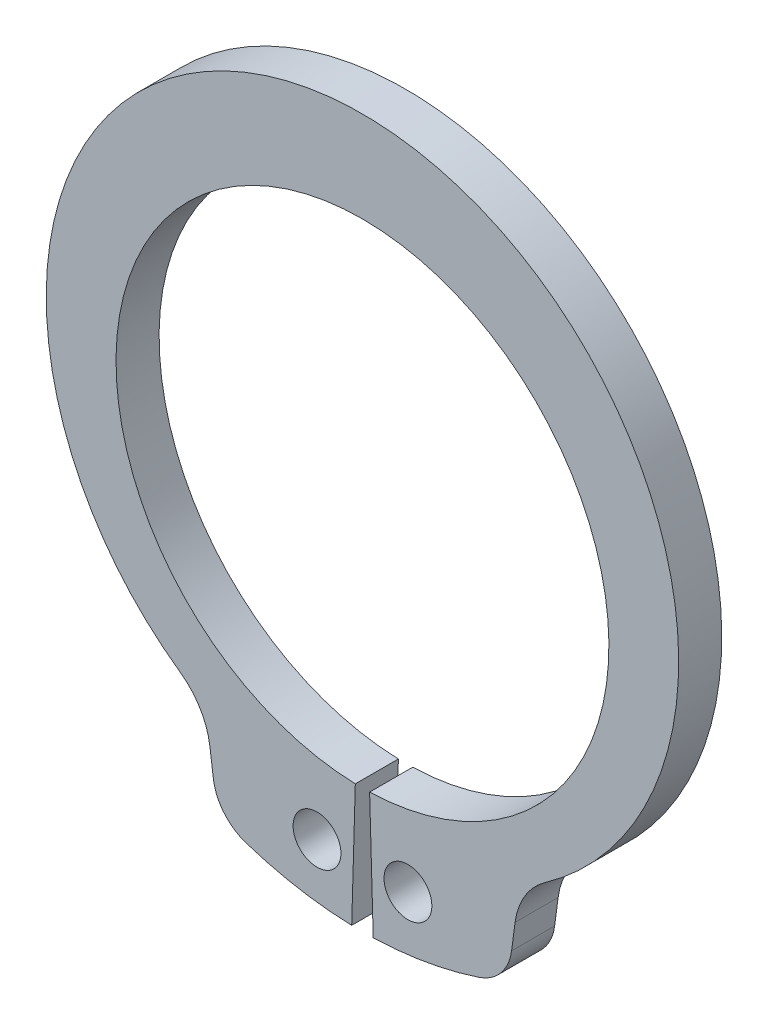
ISO-10303-21;
HEADER;
FILE_DESCRIPTION(('STEP AP214'),'2;1');
FILE_NAME('part.step','',(''),(''),'','','');
FILE_SCHEMA(('AUTOMOTIVE_DESIGN { 1 0 10303 214 1 1 1 1 }'));
ENDSEC;
DATA;
#1=APPLICATION_CONTEXT('core data for automotive mechanical design processes');
#2=APPLICATION_PROTOCOL_DEFINITION('international standard','automotive_design',2000,#1);
#3=PRODUCT_CONTEXT('',#1,'mechanical');
#4=PRODUCT('Part','Part','',(#3));
#5=PRODUCT_RELATED_PRODUCT_CATEGORY('part','',(#4));
#6=PRODUCT_DEFINITION_FORMATION('','',#4);
#7=PRODUCT_DEFINITION_CONTEXT('part definition',#1,'design');
#8=PRODUCT_DEFINITION('design','',#6,#7);
#9=PRODUCT_DEFINITION_SHAPE('','',#8);
#10=(LENGTH_UNIT() NAMED_UNIT(*) SI_UNIT(.MILLI.,.METRE.));
#11=(NAMED_UNIT(*) PLANE_ANGLE_UNIT() SI_UNIT($,.RADIAN.));
#12=(NAMED_UNIT(*) SI_UNIT($,.STERADIAN.) SOLID_ANGLE_UNIT());
#13=UNCERTAINTY_MEASURE_WITH_UNIT(LENGTH_MEASURE(1.E-05),#10,'distance_accuracy_value','');
#14=(GEOMETRIC_REPRESENTATION_CONTEXT(3) GLOBAL_UNCERTAINTY_ASSIGNED_CONTEXT((#13)) GLOBAL_UNIT_ASSIGNED_CONTEXT((#10,
#11,#12)) REPRESENTATION_CONTEXT('',''));
#15=CARTESIAN_POINT('',(0.,0.,0.));
#16=DIRECTION('',(0.,0.,1.));
#17=DIRECTION('',(1.,0.,0.));
#18=AXIS2_PLACEMENT_3D('',#15,#16,#17);
#19=CARTESIAN_POINT('',(0.,0.,-0.9));
#20=DIRECTION('',(0.,0.,1.));
#21=DIRECTION('',(1.,0.,0.));
#22=AXIS2_PLACEMENT_3D('',#19,#20,#21);
#23=CYLINDRICAL_SURFACE('',#22,5.15);
#24=CARTESIAN_POINT('',(0.,0.,0.));
#25=DIRECTION('',(0.,0.,-1.));
#26=DIRECTION('',(1.,0.,0.));
#27=AXIS2_PLACEMENT_3D('',#24,#25,#26);
#28=CIRCLE('',#27,5.15);
#29=CARTESIAN_POINT('',(-0.149516129032258,-5.14782914704434,0.));
#30=VERTEX_POINT('',#29);
#31=CARTESIAN_POINT('',(0.149516129032258,-5.14782914704434,0.));
#32=VERTEX_POINT('',#31);
#33=EDGE_CURVE('E153',#30,#32,#28,.T.);
#34=ORIENTED_EDGE('',*,*,#33,.F.);
#35=DIRECTION('',(0.,0.,1.));
#36=VECTOR('',#35,1.);
#37=CARTESIAN_POINT('',(-0.149516129032258,-5.14782914704434,-0.9));
#38=LINE('',#37,#36);
#39=CARTESIAN_POINT('',(-0.149516129032258,-5.14782914704434,-0.9));
#40=VERTEX_POINT('',#39);
#41=EDGE_CURVE('E11',#40,#30,#38,.T.);
#42=ORIENTED_EDGE('',*,*,#41,.F.);
#43=CARTESIAN_POINT('',(0.,0.,-0.9));
#44=DIRECTION('',(0.,0.,-1.));
#45=DIRECTION('',(1.,0.,0.));
#46=AXIS2_PLACEMENT_3D('',#43,#44,#45);
#47=CIRCLE('',#46,5.15);
#48=CARTESIAN_POINT('',(0.149516129032258,-5.14782914704434,-0.9));
#49=VERTEX_POINT('',#48);
#50=EDGE_CURVE('E186',#40,#49,#47,.T.);
#51=ORIENTED_EDGE('',*,*,#50,.T.);
#52=DIRECTION('',(0.,0.,1.));
#53=VECTOR('',#52,1.);
#54=CARTESIAN_POINT('',(0.149516129032258,-5.14782914704434,-0.9));
#55=LINE('',#54,#53);
#56=EDGE_CURVE('E35',#49,#32,#55,.T.);
#57=ORIENTED_EDGE('',*,*,#56,.T.);
#58=EDGE_LOOP('',(#34,#42,#51,#57));
#59=FACE_BOUND('',#58,.T.);
#60=ADVANCED_FACE('F32',(#59),#23,.F.);
#61=CARTESIAN_POINT('',(-0.149516129032258,-5.14782914704434,-0.9));
#62=DIRECTION('',(0.99957847515424,-0.0290322580645161,0.));
#63=DIRECTION('',(0.0290322580645161,0.99957847515424,0.));
#64=AXIS2_PLACEMENT_3D('',#61,#62,#63);
#65=PLANE('',#64);
#66=DIRECTION('',(0.0290322580645161,0.99957847515424,0.));
#67=VECTOR('',#66,1.);
#68=CARTESIAN_POINT('',(-0.149516129032258,-5.14782914704434,0.));
#69=LINE('',#68,#67);
#70=CARTESIAN_POINT('',(-0.225,-7.74673318244536,0.));
#71=VERTEX_POINT('',#70);
#72=EDGE_CURVE('E184',#71,#30,#69,.T.);
#73=ORIENTED_EDGE('',*,*,#72,.F.);
#74=DIRECTION('',(0.,0.,1.));
#75=VECTOR('',#74,1.);
#76=CARTESIAN_POINT('',(-0.225,-7.74673318244536,-0.9));
#77=LINE('',#76,#75);
#78=CARTESIAN_POINT('',(-0.225,-7.74673318244536,-0.9));
#79=VERTEX_POINT('',#78);
#80=EDGE_CURVE('E41',#79,#71,#77,.T.);
#81=ORIENTED_EDGE('',*,*,#80,.F.);
#82=DIRECTION('',(0.0290322580645161,0.99957847515424,0.));
#83=VECTOR('',#82,1.);
#84=CARTESIAN_POINT('',(-0.149516129032258,-5.14782914704434,-0.9));
#85=LINE('',#84,#83);
#86=EDGE_CURVE('E143',#79,#40,#85,.T.);
#87=ORIENTED_EDGE('',*,*,#86,.T.);
#88=ORIENTED_EDGE('',*,*,#41,.T.);
#89=EDGE_LOOP('',(#73,#81,#87,#88));
#90=FACE_BOUND('',#89,.T.);
#91=ADVANCED_FACE('F206',(#90),#65,.T.);
#92=CARTESIAN_POINT('',(0.,0.,-0.9));
#93=DIRECTION('',(0.,0.,1.));
#94=DIRECTION('',(1.,0.,0.));
#95=AXIS2_PLACEMENT_3D('',#92,#93,#94);
#96=CYLINDRICAL_SURFACE('',#95,7.75);
#97=CARTESIAN_POINT('',(0.,0.,0.));
#98=DIRECTION('',(0.,0.,1.));
#99=DIRECTION('',(1.,0.,0.));
#100=AXIS2_PLACEMENT_3D('',#97,#98,#99);
#101=CIRCLE('',#100,7.75);
#102=CARTESIAN_POINT('',(-2.43932707042662,-7.35609838457071,0.));
#103=VERTEX_POINT('',#102);
#104=EDGE_CURVE('E130',#103,#71,#101,.T.);
#105=ORIENTED_EDGE('',*,*,#104,.F.);
#106=DIRECTION('',(0.,0.,1.));
#107=VECTOR('',#106,1.);
#108=CARTESIAN_POINT('',(-2.43932707042662,-7.35609838457071,-0.9));
#109=LINE('',#108,#107);
#110=CARTESIAN_POINT('',(-2.43932707042662,-7.35609838457071,-0.9));
#111=VERTEX_POINT('',#110);
#112=EDGE_CURVE('E125',#111,#103,#109,.T.);
#113=ORIENTED_EDGE('',*,*,#112,.F.);
#114=CARTESIAN_POINT('',(0.,0.,-0.9));
#115=DIRECTION('',(0.,0.,1.));
#116=DIRECTION('',(1.,0.,0.));
#117=AXIS2_PLACEMENT_3D('',#114,#115,#116);
#118=CIRCLE('',#117,7.75);
#119=EDGE_CURVE('E128',#111,#79,#118,.T.);
#120=ORIENTED_EDGE('',*,*,#119,.T.);
#121=ORIENTED_EDGE('',*,*,#80,.T.);
#122=EDGE_LOOP('',(#105,#113,#120,#121));
#123=FACE_BOUND('',#122,.T.);
#124=ADVANCED_FACE('F127',(#123),#96,.T.);
#125=CARTESIAN_POINT('',(-2.12457519037158,-6.40692439946482,-0.9));
#126=DIRECTION('',(0.,0.,1.));
#127=DIRECTION('',(1.,0.,0.));
#128=AXIS2_PLACEMENT_3D('',#125,#126,#127);
#129=CYLINDRICAL_SURFACE('',#128,1.);
#130=CARTESIAN_POINT('',(-2.12457519037158,-6.40692439946482,0.));
#131=DIRECTION('',(0.,0.,1.));
#132=DIRECTION('',(1.,0.,0.));
#133=AXIS2_PLACEMENT_3D('',#130,#131,#132);
#134=CIRCLE('',#133,1.);
#135=CARTESIAN_POINT('',(-3.11602005174539,-6.53745059168487,0.));
#136=VERTEX_POINT('',#135);
#137=EDGE_CURVE('E181',#136,#103,#134,.T.);
#138=ORIENTED_EDGE('',*,*,#137,.F.);
#139=DIRECTION('',(0.,0.,1.));
#140=VECTOR('',#139,1.);
#141=CARTESIAN_POINT('',(-3.11602005174539,-6.53745059168487,-0.9));
#142=LINE('',#141,#140);
#143=CARTESIAN_POINT('',(-3.11602005174539,-6.53745059168487,-0.9));
#144=VERTEX_POINT('',#143);
#145=EDGE_CURVE('E135',#144,#136,#142,.T.);
#146=ORIENTED_EDGE('',*,*,#145,.F.);
#147=CARTESIAN_POINT('',(-2.12457519037158,-6.40692439946482,-0.9));
#148=DIRECTION('',(0.,0.,1.));
#149=DIRECTION('',(1.,0.,0.));
#150=AXIS2_PLACEMENT_3D('',#147,#148,#149);
#151=CIRCLE('',#150,1.);
#152=EDGE_CURVE('E141',#144,#111,#151,.T.);
#153=ORIENTED_EDGE('',*,*,#152,.T.);
#154=ORIENTED_EDGE('',*,*,#112,.T.);
#155=EDGE_LOOP('',(#138,#146,#153,#154));
#156=FACE_BOUND('',#155,.T.);
#157=ADVANCED_FACE('F145',(#156),#129,.T.);
#158=CARTESIAN_POINT('',(-3.18866917349961,-5.98562572633434,-0.9));
#159=DIRECTION('',(-0.99144486137381,-0.130526192220052,0.));
#160=DIRECTION('',(0.130526192220052,-0.99144486137381,0.));
#161=AXIS2_PLACEMENT_3D('',#158,#159,#160);
#162=PLANE('',#161);
#163=DIRECTION('',(0.130526192220052,-0.99144486137381,0.));
#164=VECTOR('',#163,1.);
#165=CARTESIAN_POINT('',(-3.18866917349961,-5.98562572633434,0.));
#166=LINE('',#165,#164);
#167=CARTESIAN_POINT('',(-3.18866917349961,-5.98562572633434,0.));
#168=VERTEX_POINT('',#167);
#169=EDGE_CURVE('E178',#168,#136,#166,.T.);
#170=ORIENTED_EDGE('',*,*,#169,.F.);
#171=DIRECTION('',(0.,0.,1.));
#172=VECTOR('',#171,1.);
#173=CARTESIAN_POINT('',(-3.18866917349961,-5.98562572633434,-0.9));
#174=LINE('',#173,#172);
#175=CARTESIAN_POINT('',(-3.18866917349961,-5.98562572633434,-0.9));
#176=VERTEX_POINT('',#175);
#177=EDGE_CURVE('E190',#176,#168,#174,.T.);
#178=ORIENTED_EDGE('',*,*,#177,.F.);
#179=DIRECTION('',(0.130526192220052,-0.99144486137381,0.));
#180=VECTOR('',#179,1.);
#181=CARTESIAN_POINT('',(-3.18866917349961,-5.98562572633434,-0.9));
#182=LINE('',#181,#180);
#183=EDGE_CURVE('E146',#176,#144,#182,.T.);
#184=ORIENTED_EDGE('',*,*,#183,.T.);
#185=ORIENTED_EDGE('',*,*,#145,.T.);
#186=EDGE_LOOP('',(#170,#178,#184,#185));
#187=FACE_BOUND('',#186,.T.);
#188=ADVANCED_FACE('F219',(#187),#162,.T.);
#189=CARTESIAN_POINT('',(-4.67484922074798,-6.18128504141914,-0.9));
#190=DIRECTION('',(0.,0.,1.));
#191=DIRECTION('',(1.,0.,0.));
#192=AXIS2_PLACEMENT_3D('',#189,#190,#191);
#193=CYLINDRICAL_SURFACE('',#192,1.49900423629108);
#194=CARTESIAN_POINT('',(-4.67484922074798,-6.18128504141914,0.));
#195=DIRECTION('',(0.,0.,-1.));
#196=DIRECTION('',(1.,0.,0.));
#197=AXIS2_PLACEMENT_3D('',#194,#195,#196);
#198=CIRCLE('',#197,1.49900423629108);
#199=CARTESIAN_POINT('',(-3.81045349680799,-4.95660805018722,0.));
#200=VERTEX_POINT('',#199);
#201=EDGE_CURVE('E175',#200,#168,#198,.T.);
#202=ORIENTED_EDGE('',*,*,#201,.F.);
#203=DIRECTION('',(0.,0.,1.));
#204=VECTOR('',#203,1.);
#205=CARTESIAN_POINT('',(-3.81045349680799,-4.95660805018722,-0.9));
#206=LINE('',#205,#204);
#207=CARTESIAN_POINT('',(-3.81045349680799,-4.95660805018722,-0.9));
#208=VERTEX_POINT('',#207);
#209=EDGE_CURVE('E192',#208,#200,#206,.T.);
#210=ORIENTED_EDGE('',*,*,#209,.F.);
#211=CARTESIAN_POINT('',(-4.67484922074798,-6.18128504141914,-0.9));
#212=DIRECTION('',(0.,0.,-1.));
#213=DIRECTION('',(1.,0.,0.));
#214=AXIS2_PLACEMENT_3D('',#211,#212,#213);
#215=CIRCLE('',#214,1.49900423629108);
#216=EDGE_CURVE('E148',#208,#176,#215,.T.);
#217=ORIENTED_EDGE('',*,*,#216,.T.);
#218=ORIENTED_EDGE('',*,*,#177,.T.);
#219=EDGE_LOOP('',(#202,#210,#217,#218));
#220=FACE_BOUND('',#219,.T.);
#221=ADVANCED_FACE('F222',(#220),#193,.F.);
#222=CARTESIAN_POINT('',(0.,0.442047443420854,-0.9));
#223=DIRECTION('',(0.,0.,1.));
#224=DIRECTION('',(1.,0.,0.));
#225=AXIS2_PLACEMENT_3D('',#222,#223,#224);
#226=CYLINDRICAL_SURFACE('',#225,6.60795255657915);
#227=CARTESIAN_POINT('',(0.,0.442047443420854,0.));
#228=DIRECTION('',(0.,0.,1.));
#229=DIRECTION('',(1.,0.,0.));
#230=AXIS2_PLACEMENT_3D('',#227,#228,#229);
#231=CIRCLE('',#230,6.60795255657915);
#232=CARTESIAN_POINT('',(3.81045349680799,-4.95660805018722,0.));
#233=VERTEX_POINT('',#232);
#234=EDGE_CURVE('E172',#233,#200,#231,.T.);
#235=ORIENTED_EDGE('',*,*,#234,.F.);
#236=DIRECTION('',(0.,0.,1.));
#237=VECTOR('',#236,1.);
#238=CARTESIAN_POINT('',(3.81045349680799,-4.95660805018722,-0.9));
#239=LINE('',#238,#237);
#240=CARTESIAN_POINT('',(3.81045349680799,-4.95660805018722,-0.9));
#241=VERTEX_POINT('',#240);
#242=EDGE_CURVE('E194',#241,#233,#239,.T.);
#243=ORIENTED_EDGE('',*,*,#242,.F.);
#244=CARTESIAN_POINT('',(0.,0.442047443420854,-0.9));
#245=DIRECTION('',(0.,0.,1.));
#246=DIRECTION('',(1.,0.,0.));
#247=AXIS2_PLACEMENT_3D('',#244,#245,#246);
#248=CIRCLE('',#247,6.60795255657915);
#249=EDGE_CURVE('E296',#241,#208,#248,.T.);
#250=ORIENTED_EDGE('',*,*,#249,.T.);
#251=ORIENTED_EDGE('',*,*,#209,.T.);
#252=EDGE_LOOP('',(#235,#243,#250,#251));
#253=FACE_BOUND('',#252,.T.);
#254=ADVANCED_FACE('F226',(#253),#226,.T.);
#255=CARTESIAN_POINT('',(4.67484922074798,-6.18128504141914,-0.9));
#256=DIRECTION('',(0.,0.,1.));
#257=DIRECTION('',(1.,0.,0.));
#258=AXIS2_PLACEMENT_3D('',#255,#256,#257);
#259=CYLINDRICAL_SURFACE('',#258,1.49900423629108);
#260=CARTESIAN_POINT('',(4.67484922074798,-6.18128504141914,0.));
#261=DIRECTION('',(0.,0.,-1.));
#262=DIRECTION('',(1.,0.,0.));
#263=AXIS2_PLACEMENT_3D('',#260,#261,#262);
#264=CIRCLE('',#263,1.49900423629108);
#265=CARTESIAN_POINT('',(3.18866917349961,-5.98562572633434,0.));
#266=VERTEX_POINT('',#265);
#267=EDGE_CURVE('E169',#266,#233,#264,.T.);
#268=ORIENTED_EDGE('',*,*,#267,.F.);
#269=DIRECTION('',(0.,0.,1.));
#270=VECTOR('',#269,1.);
#271=CARTESIAN_POINT('',(3.18866917349961,-5.98562572633434,-0.9));
#272=LINE('',#271,#270);
#273=CARTESIAN_POINT('',(3.18866917349961,-5.98562572633434,-0.9));
#274=VERTEX_POINT('',#273);
#275=EDGE_CURVE('E196',#274,#266,#272,.T.);
#276=ORIENTED_EDGE('',*,*,#275,.F.);
#277=CARTESIAN_POINT('',(4.67484922074798,-6.18128504141914,-0.9));
#278=DIRECTION('',(0.,0.,-1.));
#279=DIRECTION('',(1.,0.,0.));
#280=AXIS2_PLACEMENT_3D('',#277,#278,#279);
#281=CIRCLE('',#280,1.49900423629108);
#282=EDGE_CURVE('E293',#274,#241,#281,.T.);
#283=ORIENTED_EDGE('',*,*,#282,.T.);
#284=ORIENTED_EDGE('',*,*,#242,.T.);
#285=EDGE_LOOP('',(#268,#276,#283,#284));
#286=FACE_BOUND('',#285,.T.);
#287=ADVANCED_FACE('F230',(#286),#259,.F.);
#288=CARTESIAN_POINT('',(3.18866917349961,-5.98562572633434,-0.9));
#289=DIRECTION('',(0.99144486137381,-0.130526192220052,0.));
#290=DIRECTION('',(0.130526192220052,0.99144486137381,0.));
#291=AXIS2_PLACEMENT_3D('',#288,#289,#290);
#292=PLANE('',#291);
#293=DIRECTION('',(0.130526192220052,0.99144486137381,0.));
#294=VECTOR('',#293,1.);
#295=CARTESIAN_POINT('',(3.18866917349961,-5.98562572633434,0.));
#296=LINE('',#295,#294);
#297=CARTESIAN_POINT('',(3.11602005174539,-6.53745059168487,0.));
#298=VERTEX_POINT('',#297);
#299=EDGE_CURVE('E166',#298,#266,#296,.T.);
#300=ORIENTED_EDGE('',*,*,#299,.F.);
#301=DIRECTION('',(0.,0.,1.));
#302=VECTOR('',#301,1.);
#303=CARTESIAN_POINT('',(3.11602005174539,-6.53745059168487,-0.9));
#304=LINE('',#303,#302);
#305=CARTESIAN_POINT('',(3.11602005174539,-6.53745059168487,-0.9));
#306=VERTEX_POINT('',#305);
#307=EDGE_CURVE('E198',#306,#298,#304,.T.);
#308=ORIENTED_EDGE('',*,*,#307,.F.);
#309=DIRECTION('',(0.130526192220052,0.99144486137381,0.));
#310=VECTOR('',#309,1.);
#311=CARTESIAN_POINT('',(3.18866917349961,-5.98562572633434,-0.9));
#312=LINE('',#311,#310);
#313=EDGE_CURVE('E290',#306,#274,#312,.T.);
#314=ORIENTED_EDGE('',*,*,#313,.T.);
#315=ORIENTED_EDGE('',*,*,#275,.T.);
#316=EDGE_LOOP('',(#300,#308,#314,#315));
#317=FACE_BOUND('',#316,.T.);
#318=ADVANCED_FACE('F234',(#317),#292,.T.);
#319=CARTESIAN_POINT('',(2.12457519037158,-6.40692439946482,-0.9));
#320=DIRECTION('',(0.,0.,1.));
#321=DIRECTION('',(1.,0.,0.));
#322=AXIS2_PLACEMENT_3D('',#319,#320,#321);
#323=CYLINDRICAL_SURFACE('',#322,1.);
#324=CARTESIAN_POINT('',(2.12457519037158,-6.40692439946482,0.));
#325=DIRECTION('',(0.,0.,1.));
#326=DIRECTION('',(-1.,0.,0.));
#327=AXIS2_PLACEMENT_3D('',#324,#325,#326);
#328=CIRCLE('',#327,1.);
#329=CARTESIAN_POINT('',(2.43932707042662,-7.35609838457071,0.));
#330=VERTEX_POINT('',#329);
#331=EDGE_CURVE('E163',#330,#298,#328,.T.);
#332=ORIENTED_EDGE('',*,*,#331,.F.);
#333=DIRECTION('',(0.,0.,1.));
#334=VECTOR('',#333,1.);
#335=CARTESIAN_POINT('',(2.43932707042662,-7.35609838457071,-0.9));
#336=LINE('',#335,#334);
#337=CARTESIAN_POINT('',(2.43932707042662,-7.35609838457071,-0.9));
#338=VERTEX_POINT('',#337);
#339=EDGE_CURVE('E200',#338,#330,#336,.T.);
#340=ORIENTED_EDGE('',*,*,#339,.F.);
#341=CARTESIAN_POINT('',(2.12457519037158,-6.40692439946482,-0.9));
#342=DIRECTION('',(0.,0.,1.));
#343=DIRECTION('',(-1.,0.,0.));
#344=AXIS2_PLACEMENT_3D('',#341,#342,#343);
#345=CIRCLE('',#344,1.);
#346=EDGE_CURVE('E287',#338,#306,#345,.T.);
#347=ORIENTED_EDGE('',*,*,#346,.T.);
#348=ORIENTED_EDGE('',*,*,#307,.T.);
#349=EDGE_LOOP('',(#332,#340,#347,#348));
#350=FACE_BOUND('',#349,.T.);
#351=ADVANCED_FACE('F238',(#350),#323,.T.);
#352=CARTESIAN_POINT('',(0.,0.,-0.9));
#353=DIRECTION('',(0.,0.,1.));
#354=DIRECTION('',(1.,0.,0.));
#355=AXIS2_PLACEMENT_3D('',#352,#353,#354);
#356=CYLINDRICAL_SURFACE('',#355,7.75);
#357=CARTESIAN_POINT('',(0.,0.,0.));
#358=DIRECTION('',(0.,0.,1.));
#359=DIRECTION('',(1.,0.,0.));
#360=AXIS2_PLACEMENT_3D('',#357,#358,#359);
#361=CIRCLE('',#360,7.75);
#362=CARTESIAN_POINT('',(0.224999999999997,-7.74673318244536,0.));
#363=VERTEX_POINT('',#362);
#364=EDGE_CURVE('E160',#363,#330,#361,.T.);
#365=ORIENTED_EDGE('',*,*,#364,.F.);
#366=DIRECTION('',(0.,0.,1.));
#367=VECTOR('',#366,1.);
#368=CARTESIAN_POINT('',(0.224999999999997,-7.74673318244536,-0.9));
#369=LINE('',#368,#367);
#370=CARTESIAN_POINT('',(0.224999999999997,-7.74673318244536,-0.9));
#371=VERTEX_POINT('',#370);
#372=EDGE_CURVE('E201',#371,#363,#369,.T.);
#373=ORIENTED_EDGE('',*,*,#372,.F.);
#374=CARTESIAN_POINT('',(0.,0.,-0.9));
#375=DIRECTION('',(0.,0.,1.));
#376=DIRECTION('',(1.,0.,0.));
#377=AXIS2_PLACEMENT_3D('',#374,#375,#376);
#378=CIRCLE('',#377,7.75);
#379=EDGE_CURVE('E284',#371,#338,#378,.T.);
#380=ORIENTED_EDGE('',*,*,#379,.T.);
#381=ORIENTED_EDGE('',*,*,#339,.T.);
#382=EDGE_LOOP('',(#365,#373,#380,#381));
#383=FACE_BOUND('',#382,.T.);
#384=ADVANCED_FACE('F242',(#383),#356,.T.);
#385=CARTESIAN_POINT('',(0.149516129032258,-5.14782914704434,-0.9));
#386=DIRECTION('',(-0.99957847515424,-0.0290322580645161,0.));
#387=DIRECTION('',(0.0290322580645161,-0.99957847515424,0.));
#388=AXIS2_PLACEMENT_3D('',#385,#386,#387);
#389=PLANE('',#388);
#390=DIRECTION('',(0.0290322580645161,-0.99957847515424,0.));
#391=VECTOR('',#390,1.);
#392=CARTESIAN_POINT('',(0.149516129032258,-5.14782914704434,0.));
#393=LINE('',#392,#391);
#394=EDGE_CURVE('E156',#32,#363,#393,.T.);
#395=ORIENTED_EDGE('',*,*,#394,.F.);
#396=ORIENTED_EDGE('',*,*,#56,.F.);
#397=DIRECTION('',(0.0290322580645161,-0.99957847515424,0.));
#398=VECTOR('',#397,1.);
#399=CARTESIAN_POINT('',(0.149516129032258,-5.14782914704434,-0.9));
#400=LINE('',#399,#398);
#401=EDGE_CURVE('E282',#49,#371,#400,.T.);
#402=ORIENTED_EDGE('',*,*,#401,.T.);
#403=ORIENTED_EDGE('',*,*,#372,.T.);
#404=EDGE_LOOP('',(#395,#396,#402,#403));
#405=FACE_BOUND('',#404,.T.);
#406=ADVANCED_FACE('F203',(#405),#389,.T.);
#407=CARTESIAN_POINT('',(0.,0.,-0.9));
#408=DIRECTION('',(0.,0.,1.));
#409=DIRECTION('',(1.,0.,0.));
#410=AXIS2_PLACEMENT_3D('',#407,#408,#409);
#411=PLANE('',#410);
#412=CARTESIAN_POINT('',(-0.95,-6.55653300151841,-0.9));
#413=DIRECTION('',(0.,0.,1.));
#414=DIRECTION('',(1.,0.,0.));
#415=AXIS2_PLACEMENT_3D('',#412,#413,#414);
#416=CIRCLE('',#415,0.5);
#417=CARTESIAN_POINT('',(-0.45,-6.55653300151841,-0.9));
#418=VERTEX_POINT('',#417);
#419=EDGE_CURVE('E269',#418,#418,#416,.T.);
#420=ORIENTED_EDGE('',*,*,#419,.T.);
#421=EDGE_LOOP('',(#420));
#422=FACE_BOUND('',#421,.T.);
#423=CARTESIAN_POINT('',(0.95,-6.55653300151841,-0.9));
#424=DIRECTION('',(0.,0.,1.));
#425=DIRECTION('',(1.,0.,0.));
#426=AXIS2_PLACEMENT_3D('',#423,#424,#425);
#427=CIRCLE('',#426,0.5);
#428=CARTESIAN_POINT('',(1.45,-6.55653300151841,-0.9));
#429=VERTEX_POINT('',#428);
#430=EDGE_CURVE('E157',#429,#429,#427,.T.);
#431=ORIENTED_EDGE('',*,*,#430,.T.);
#432=EDGE_LOOP('',(#431));
#433=FACE_BOUND('',#432,.T.);
#434=ORIENTED_EDGE('',*,*,#50,.F.);
#435=ORIENTED_EDGE('',*,*,#86,.F.);
#436=ORIENTED_EDGE('',*,*,#119,.F.);
#437=ORIENTED_EDGE('',*,*,#152,.F.);
#438=ORIENTED_EDGE('',*,*,#183,.F.);
#439=ORIENTED_EDGE('',*,*,#216,.F.);
#440=ORIENTED_EDGE('',*,*,#249,.F.);
#441=ORIENTED_EDGE('',*,*,#282,.F.);
#442=ORIENTED_EDGE('',*,*,#313,.F.);
#443=ORIENTED_EDGE('',*,*,#346,.F.);
#444=ORIENTED_EDGE('',*,*,#379,.F.);
#445=ORIENTED_EDGE('',*,*,#401,.F.);
#446=EDGE_LOOP('',(#434,#435,#436,#437,#438,#439,#440,#441,#442,#443,#444,#445));
#447=FACE_BOUND('',#446,.T.);
#448=ADVANCED_FACE('F139',(#422,#433,#447),#411,.F.);
#449=CARTESIAN_POINT('',(0.,0.,0.));
#450=DIRECTION('',(0.,0.,1.));
#451=DIRECTION('',(1.,0.,0.));
#452=AXIS2_PLACEMENT_3D('',#449,#450,#451);
#453=PLANE('',#452);
#454=CARTESIAN_POINT('',(-0.95,-6.55653300151841,0.));
#455=DIRECTION('',(0.,0.,1.));
#456=DIRECTION('',(1.,0.,0.));
#457=AXIS2_PLACEMENT_3D('',#454,#455,#456);
#458=CIRCLE('',#457,0.5);
#459=CARTESIAN_POINT('',(-0.45,-6.55653300151841,0.));
#460=VERTEX_POINT('',#459);
#461=EDGE_CURVE('E272',#460,#460,#458,.T.);
#462=ORIENTED_EDGE('',*,*,#461,.F.);
#463=EDGE_LOOP('',(#462));
#464=FACE_BOUND('',#463,.T.);
#465=CARTESIAN_POINT('',(0.95,-6.55653300151841,0.));
#466=DIRECTION('',(0.,0.,1.));
#467=DIRECTION('',(1.,0.,0.));
#468=AXIS2_PLACEMENT_3D('',#465,#466,#467);
#469=CIRCLE('',#468,0.5);
#470=CARTESIAN_POINT('',(1.45,-6.55653300151841,0.));
#471=VERTEX_POINT('',#470);
#472=EDGE_CURVE('E274',#471,#471,#469,.T.);
#473=ORIENTED_EDGE('',*,*,#472,.F.);
#474=EDGE_LOOP('',(#473));
#475=FACE_BOUND('',#474,.T.);
#476=ORIENTED_EDGE('',*,*,#33,.T.);
#477=ORIENTED_EDGE('',*,*,#394,.T.);
#478=ORIENTED_EDGE('',*,*,#364,.T.);
#479=ORIENTED_EDGE('',*,*,#331,.T.);
#480=ORIENTED_EDGE('',*,*,#299,.T.);
#481=ORIENTED_EDGE('',*,*,#267,.T.);
#482=ORIENTED_EDGE('',*,*,#234,.T.);
#483=ORIENTED_EDGE('',*,*,#201,.T.);
#484=ORIENTED_EDGE('',*,*,#169,.T.);
#485=ORIENTED_EDGE('',*,*,#137,.T.);
#486=ORIENTED_EDGE('',*,*,#104,.T.);
#487=ORIENTED_EDGE('',*,*,#72,.T.);
#488=EDGE_LOOP('',(#476,#477,#478,#479,#480,#481,#482,#483,#484,#485,#486,#487));
#489=FACE_BOUND('',#488,.T.);
#490=ADVANCED_FACE('F205',(#464,#475,#489),#453,.T.);
#491=CARTESIAN_POINT('',(0.95,-6.55653300151841,-0.9));
#492=DIRECTION('',(0.,0.,1.));
#493=DIRECTION('',(1.,0.,0.));
#494=AXIS2_PLACEMENT_3D('',#491,#492,#493);
#495=CYLINDRICAL_SURFACE('',#494,0.5);
#496=ORIENTED_EDGE('',*,*,#430,.F.);
#497=EDGE_LOOP('',(#496));
#498=FACE_BOUND('',#497,.T.);
#499=ORIENTED_EDGE('',*,*,#472,.T.);
#500=EDGE_LOOP('',(#499));
#501=FACE_BOUND('',#500,.T.);
#502=ADVANCED_FACE('F254',(#498,#501),#495,.F.);
#503=CARTESIAN_POINT('',(-0.95,-6.55653300151841,-0.9));
#504=DIRECTION('',(0.,0.,1.));
#505=DIRECTION('',(1.,0.,0.));
#506=AXIS2_PLACEMENT_3D('',#503,#504,#505);
#507=CYLINDRICAL_SURFACE('',#506,0.5);
#508=ORIENTED_EDGE('',*,*,#419,.F.);
#509=EDGE_LOOP('',(#508));
#510=FACE_BOUND('',#509,.T.);
#511=ORIENTED_EDGE('',*,*,#461,.T.);
#512=EDGE_LOOP('',(#511));
#513=FACE_BOUND('',#512,.T.);
#514=ADVANCED_FACE('F261',(#510,#513),#507,.F.);
#515=CLOSED_SHELL('',(#60,#91,#124,#157,#188,#221,#254,#287,#318,#351,#384,#406,#448,#490,#502,#514));
#516=MANIFOLD_SOLID_BREP('B2',#515);
#517=ADVANCED_BREP_SHAPE_REPRESENTATION('',(#18,#516),#14);
#518=SHAPE_DEFINITION_REPRESENTATION(#9,#517);
ENDSEC;
END-ISO-10303-21;
